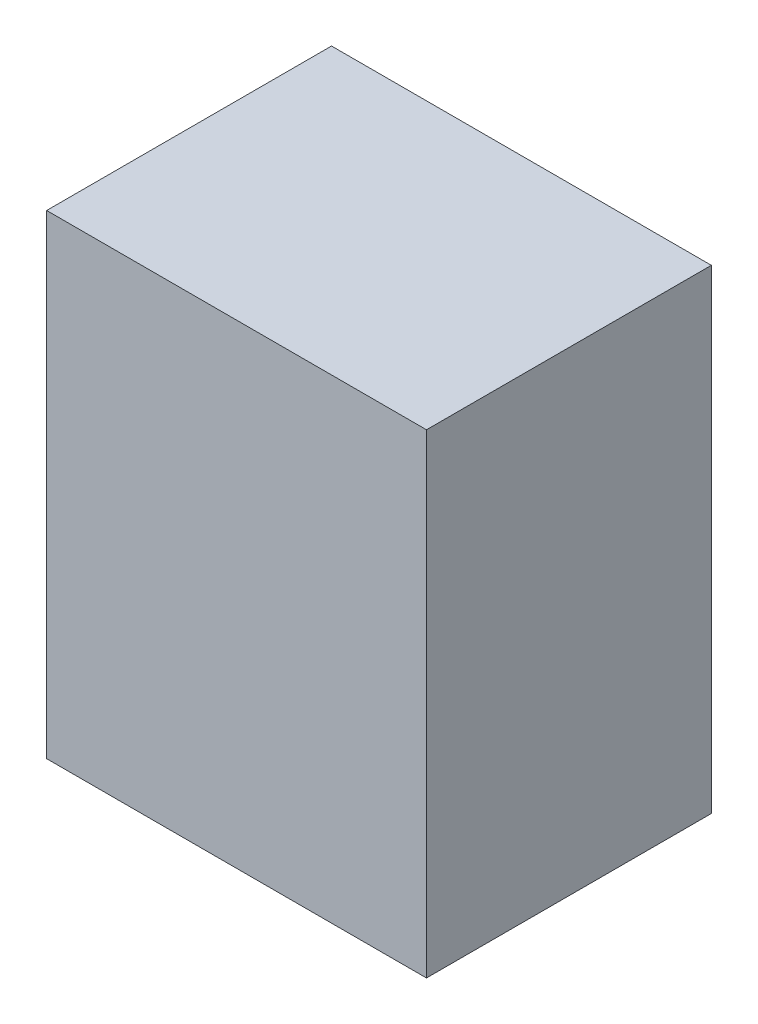
ISO-10303-21;
HEADER;
FILE_DESCRIPTION(('STEP AP214'),'2;1');
FILE_NAME('part.step','',(''),(''),'','','');
FILE_SCHEMA(('AUTOMOTIVE_DESIGN { 1 0 10303 214 1 1 1 1 }'));
ENDSEC;
DATA;
#1=APPLICATION_CONTEXT('core data for automotive mechanical design processes');
#2=APPLICATION_PROTOCOL_DEFINITION('international standard','automotive_design',2000,#1);
#3=PRODUCT_CONTEXT('',#1,'mechanical');
#4=PRODUCT('Part','Part','',(#3));
#5=PRODUCT_RELATED_PRODUCT_CATEGORY('part','',(#4));
#6=PRODUCT_DEFINITION_FORMATION('','',#4);
#7=PRODUCT_DEFINITION_CONTEXT('part definition',#1,'design');
#8=PRODUCT_DEFINITION('design','',#6,#7);
#9=PRODUCT_DEFINITION_SHAPE('','',#8);
#10=(LENGTH_UNIT() NAMED_UNIT(*) SI_UNIT(.MILLI.,.METRE.));
#11=(NAMED_UNIT(*) PLANE_ANGLE_UNIT() SI_UNIT($,.RADIAN.));
#12=(NAMED_UNIT(*) SI_UNIT($,.STERADIAN.) SOLID_ANGLE_UNIT());
#13=UNCERTAINTY_MEASURE_WITH_UNIT(LENGTH_MEASURE(1.E-05),#10,'distance_accuracy_value','');
#14=(GEOMETRIC_REPRESENTATION_CONTEXT(3) GLOBAL_UNCERTAINTY_ASSIGNED_CONTEXT((#13)) GLOBAL_UNIT_ASSIGNED_CONTEXT((#10,
#11,#12)) REPRESENTATION_CONTEXT('',''));
#15=CARTESIAN_POINT('',(0.,0.,0.));
#16=DIRECTION('',(0.,0.,1.));
#17=DIRECTION('',(1.,0.,0.));
#18=AXIS2_PLACEMENT_3D('',#15,#16,#17);
#19=CARTESIAN_POINT('',(0.,0.,6.));
#20=DIRECTION('',(1.,0.,0.));
#21=DIRECTION('',(0.,0.,-1.));
#22=AXIS2_PLACEMENT_3D('',#19,#20,#21);
#23=PLANE('',#22);
#24=DIRECTION('',(0.,-1.,0.));
#25=VECTOR('',#24,1.);
#26=CARTESIAN_POINT('',(0.,0.,0.));
#27=LINE('',#26,#25);
#28=CARTESIAN_POINT('',(0.,10.,0.));
#29=VERTEX_POINT('',#28);
#30=CARTESIAN_POINT('',(0.,0.,0.));
#31=VERTEX_POINT('',#30);
#32=EDGE_CURVE('E108',#29,#31,#27,.T.);
#33=ORIENTED_EDGE('',*,*,#32,.T.);
#34=DIRECTION('',(0.,0.,-1.));
#35=VECTOR('',#34,1.);
#36=CARTESIAN_POINT('',(0.,0.,6.));
#37=LINE('',#36,#35);
#38=CARTESIAN_POINT('',(0.,0.,6.));
#39=VERTEX_POINT('',#38);
#40=EDGE_CURVE('E11',#39,#31,#37,.T.);
#41=ORIENTED_EDGE('',*,*,#40,.F.);
#42=DIRECTION('',(0.,-1.,0.));
#43=VECTOR('',#42,1.);
#44=CARTESIAN_POINT('',(0.,0.,6.));
#45=LINE('',#44,#43);
#46=CARTESIAN_POINT('',(0.,10.,6.));
#47=VERTEX_POINT('',#46);
#48=EDGE_CURVE('E92',#47,#39,#45,.T.);
#49=ORIENTED_EDGE('',*,*,#48,.F.);
#50=DIRECTION('',(0.,0.,-1.));
#51=VECTOR('',#50,1.);
#52=CARTESIAN_POINT('',(0.,10.,6.));
#53=LINE('',#52,#51);
#54=EDGE_CURVE('E105',#47,#29,#53,.T.);
#55=ORIENTED_EDGE('',*,*,#54,.T.);
#56=EDGE_LOOP('',(#33,#41,#49,#55));
#57=FACE_BOUND('',#56,.T.);
#58=ADVANCED_FACE('F43',(#57),#23,.F.);
#59=CARTESIAN_POINT('',(0.,0.,6.));
#60=DIRECTION('',(0.,1.,0.));
#61=DIRECTION('',(0.,0.,1.));
#62=AXIS2_PLACEMENT_3D('',#59,#60,#61);
#63=PLANE('',#62);
#64=DIRECTION('',(1.,0.,0.));
#65=VECTOR('',#64,1.);
#66=CARTESIAN_POINT('',(0.,0.,0.));
#67=LINE('',#66,#65);
#68=CARTESIAN_POINT('',(8.,0.,0.));
#69=VERTEX_POINT('',#68);
#70=EDGE_CURVE('E97',#31,#69,#67,.T.);
#71=ORIENTED_EDGE('',*,*,#70,.T.);
#72=DIRECTION('',(0.,0.,-1.));
#73=VECTOR('',#72,1.);
#74=CARTESIAN_POINT('',(8.,0.,6.));
#75=LINE('',#74,#73);
#76=CARTESIAN_POINT('',(8.,0.,6.));
#77=VERTEX_POINT('',#76);
#78=EDGE_CURVE('E51',#77,#69,#75,.T.);
#79=ORIENTED_EDGE('',*,*,#78,.F.);
#80=DIRECTION('',(1.,0.,0.));
#81=VECTOR('',#80,1.);
#82=CARTESIAN_POINT('',(0.,0.,6.));
#83=LINE('',#82,#81);
#84=EDGE_CURVE('E87',#39,#77,#83,.T.);
#85=ORIENTED_EDGE('',*,*,#84,.F.);
#86=ORIENTED_EDGE('',*,*,#40,.T.);
#87=EDGE_LOOP('',(#71,#79,#85,#86));
#88=FACE_BOUND('',#87,.T.);
#89=ADVANCED_FACE('F100',(#88),#63,.F.);
#90=CARTESIAN_POINT('',(8.,0.,6.));
#91=DIRECTION('',(-1.,0.,0.));
#92=DIRECTION('',(0.,0.,1.));
#93=AXIS2_PLACEMENT_3D('',#90,#91,#92);
#94=PLANE('',#93);
#95=DIRECTION('',(0.,1.,0.));
#96=VECTOR('',#95,1.);
#97=CARTESIAN_POINT('',(8.,0.,0.));
#98=LINE('',#97,#96);
#99=CARTESIAN_POINT('',(8.,10.,0.));
#100=VERTEX_POINT('',#99);
#101=EDGE_CURVE('E78',#69,#100,#98,.T.);
#102=ORIENTED_EDGE('',*,*,#101,.T.);
#103=DIRECTION('',(0.,0.,-1.));
#104=VECTOR('',#103,1.);
#105=CARTESIAN_POINT('',(8.,10.,6.));
#106=LINE('',#105,#104);
#107=CARTESIAN_POINT('',(8.,10.,6.));
#108=VERTEX_POINT('',#107);
#109=EDGE_CURVE('E98',#108,#100,#106,.T.);
#110=ORIENTED_EDGE('',*,*,#109,.F.);
#111=DIRECTION('',(0.,1.,0.));
#112=VECTOR('',#111,1.);
#113=CARTESIAN_POINT('',(8.,0.,6.));
#114=LINE('',#113,#112);
#115=EDGE_CURVE('E95',#77,#108,#114,.T.);
#116=ORIENTED_EDGE('',*,*,#115,.F.);
#117=ORIENTED_EDGE('',*,*,#78,.T.);
#118=EDGE_LOOP('',(#102,#110,#116,#117));
#119=FACE_BOUND('',#118,.T.);
#120=ADVANCED_FACE('F99',(#119),#94,.F.);
#121=CARTESIAN_POINT('',(0.,10.,6.));
#122=DIRECTION('',(0.,-1.,0.));
#123=DIRECTION('',(0.,0.,-1.));
#124=AXIS2_PLACEMENT_3D('',#121,#122,#123);
#125=PLANE('',#124);
#126=DIRECTION('',(-1.,0.,0.));
#127=VECTOR('',#126,1.);
#128=CARTESIAN_POINT('',(0.,10.,0.));
#129=LINE('',#128,#127);
#130=EDGE_CURVE('E85',#100,#29,#129,.T.);
#131=ORIENTED_EDGE('',*,*,#130,.T.);
#132=ORIENTED_EDGE('',*,*,#54,.F.);
#133=DIRECTION('',(-1.,0.,0.));
#134=VECTOR('',#133,1.);
#135=CARTESIAN_POINT('',(0.,10.,6.));
#136=LINE('',#135,#134);
#137=EDGE_CURVE('E56',#108,#47,#136,.T.);
#138=ORIENTED_EDGE('',*,*,#137,.F.);
#139=ORIENTED_EDGE('',*,*,#109,.T.);
#140=EDGE_LOOP('',(#131,#132,#138,#139));
#141=FACE_BOUND('',#140,.T.);
#142=ADVANCED_FACE('F111',(#141),#125,.F.);
#143=CARTESIAN_POINT('',(0.,0.,6.));
#144=DIRECTION('',(0.,0.,-1.));
#145=DIRECTION('',(-1.,0.,0.));
#146=AXIS2_PLACEMENT_3D('',#143,#144,#145);
#147=PLANE('',#146);
#148=ORIENTED_EDGE('',*,*,#48,.T.);
#149=ORIENTED_EDGE('',*,*,#84,.T.);
#150=ORIENTED_EDGE('',*,*,#115,.T.);
#151=ORIENTED_EDGE('',*,*,#137,.T.);
#152=EDGE_LOOP('',(#148,#149,#150,#151));
#153=FACE_BOUND('',#152,.T.);
#154=ADVANCED_FACE('F89',(#153),#147,.F.);
#155=CARTESIAN_POINT('',(0.,0.,0.));
#156=DIRECTION('',(0.,0.,-1.));
#157=DIRECTION('',(-1.,0.,0.));
#158=AXIS2_PLACEMENT_3D('',#155,#156,#157);
#159=PLANE('',#158);
#160=ORIENTED_EDGE('',*,*,#32,.F.);
#161=ORIENTED_EDGE('',*,*,#130,.F.);
#162=ORIENTED_EDGE('',*,*,#101,.F.);
#163=ORIENTED_EDGE('',*,*,#70,.F.);
#164=EDGE_LOOP('',(#160,#161,#162,#163));
#165=FACE_BOUND('',#164,.T.);
#166=ADVANCED_FACE('F118',(#165),#159,.T.);
#167=CLOSED_SHELL('',(#58,#89,#120,#142,#154,#166));
#168=MANIFOLD_SOLID_BREP('B2',#167);
#169=ADVANCED_BREP_SHAPE_REPRESENTATION('',(#18,#168),#14);
#170=SHAPE_DEFINITION_REPRESENTATION(#9,#169);
ENDSEC;
END-ISO-10303-21;
